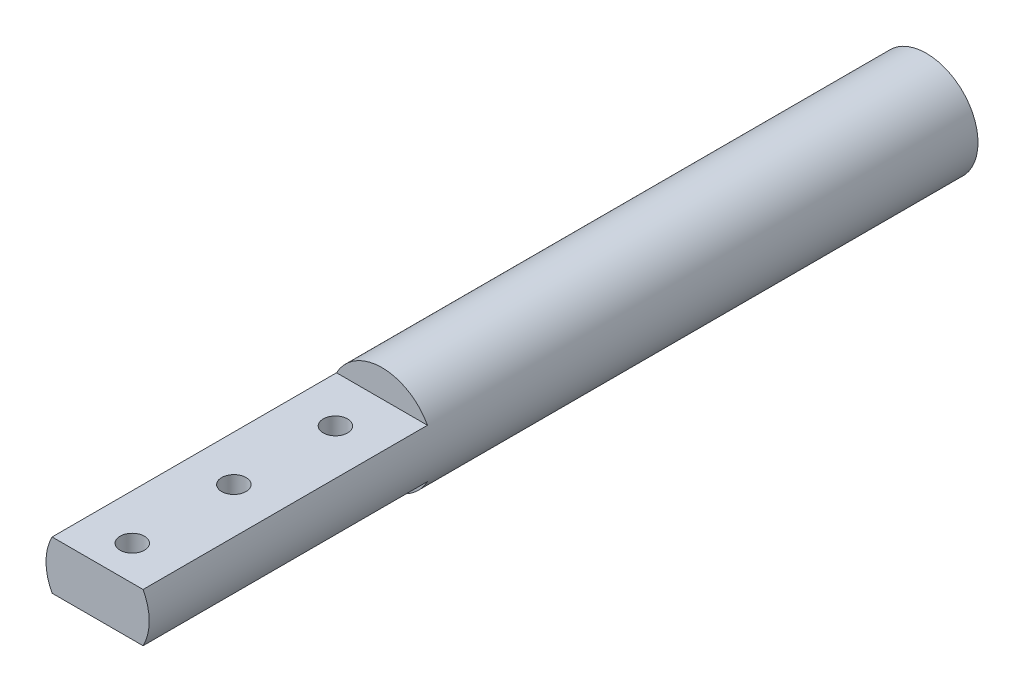
ISO-10303-21;
HEADER;
FILE_DESCRIPTION(('STEP AP214'),'2;1');
FILE_NAME('part.step','',(''),(''),'','','');
FILE_SCHEMA(('AUTOMOTIVE_DESIGN { 1 0 10303 214 1 1 1 1 }'));
ENDSEC;
DATA;
#1=APPLICATION_CONTEXT('core data for automotive mechanical design processes');
#2=APPLICATION_PROTOCOL_DEFINITION('international standard','automotive_design',2000,#1);
#3=PRODUCT_CONTEXT('',#1,'mechanical');
#4=PRODUCT('Part','Part','',(#3));
#5=PRODUCT_RELATED_PRODUCT_CATEGORY('part','',(#4));
#6=PRODUCT_DEFINITION_FORMATION('','',#4);
#7=PRODUCT_DEFINITION_CONTEXT('part definition',#1,'design');
#8=PRODUCT_DEFINITION('design','',#6,#7);
#9=PRODUCT_DEFINITION_SHAPE('','',#8);
#10=(LENGTH_UNIT() NAMED_UNIT(*) SI_UNIT(.MILLI.,.METRE.));
#11=(NAMED_UNIT(*) PLANE_ANGLE_UNIT() SI_UNIT($,.RADIAN.));
#12=(NAMED_UNIT(*) SI_UNIT($,.STERADIAN.) SOLID_ANGLE_UNIT());
#13=UNCERTAINTY_MEASURE_WITH_UNIT(LENGTH_MEASURE(1.E-05),#10,'distance_accuracy_value','');
#14=(GEOMETRIC_REPRESENTATION_CONTEXT(3) GLOBAL_UNCERTAINTY_ASSIGNED_CONTEXT((#13)) GLOBAL_UNIT_ASSIGNED_CONTEXT((#10,
#11,#12)) REPRESENTATION_CONTEXT('',''));
#15=CARTESIAN_POINT('',(0.,0.,0.));
#16=DIRECTION('',(0.,0.,1.));
#17=DIRECTION('',(1.,0.,0.));
#18=AXIS2_PLACEMENT_3D('',#15,#16,#17);
#19=CARTESIAN_POINT('',(0.,0.,51.));
#20=DIRECTION('',(0.,0.,-1.));
#21=DIRECTION('',(-1.,0.,0.));
#22=AXIS2_PLACEMENT_3D('',#19,#20,#21);
#23=CYLINDRICAL_SURFACE('',#22,6.35);
#24=CARTESIAN_POINT('',(0.,0.,51.));
#25=DIRECTION('',(0.,0.,1.));
#26=DIRECTION('',(1.,0.,0.));
#27=AXIS2_PLACEMENT_3D('',#24,#25,#26);
#28=CIRCLE('',#27,6.35);
#29=CARTESIAN_POINT('',(-5.59665078417441,3.,51.));
#30=VERTEX_POINT('',#29);
#31=CARTESIAN_POINT('',(-5.59665078417441,-3.,51.));
#32=VERTEX_POINT('',#31);
#33=EDGE_CURVE('E11',#30,#32,#28,.T.);
#34=ORIENTED_EDGE('',*,*,#33,.F.);
#35=DIRECTION('',(0.,0.,1.));
#36=VECTOR('',#35,1.);
#37=CARTESIAN_POINT('',(-5.59665078417441,3.,16.));
#38=LINE('',#37,#36);
#39=CARTESIAN_POINT('',(-5.59665078417441,3.,16.));
#40=VERTEX_POINT('',#39);
#41=EDGE_CURVE('E58',#40,#30,#38,.T.);
#42=ORIENTED_EDGE('',*,*,#41,.F.);
#43=CARTESIAN_POINT('',(0.,0.,16.));
#44=DIRECTION('',(0.,0.,1.));
#45=DIRECTION('',(1.,0.,0.));
#46=AXIS2_PLACEMENT_3D('',#43,#44,#45);
#47=CIRCLE('',#46,6.35);
#48=CARTESIAN_POINT('',(5.59665078417441,3.,16.));
#49=VERTEX_POINT('',#48);
#50=EDGE_CURVE('E77',#49,#40,#47,.T.);
#51=ORIENTED_EDGE('',*,*,#50,.F.);
#52=DIRECTION('',(0.,0.,1.));
#53=VECTOR('',#52,1.);
#54=CARTESIAN_POINT('',(5.59665078417441,3.,16.));
#55=LINE('',#54,#53);
#56=CARTESIAN_POINT('',(5.59665078417441,3.,51.));
#57=VERTEX_POINT('',#56);
#58=EDGE_CURVE('E85',#49,#57,#55,.T.);
#59=ORIENTED_EDGE('',*,*,#58,.T.);
#60=CARTESIAN_POINT('',(5.59665078417441,-3.,51.));
#61=VERTEX_POINT('',#60);
#62=EDGE_CURVE('E43',#61,#57,#28,.T.);
#63=ORIENTED_EDGE('',*,*,#62,.F.);
#64=DIRECTION('',(0.,0.,1.));
#65=VECTOR('',#64,1.);
#66=CARTESIAN_POINT('',(5.59665078417441,-3.,16.));
#67=LINE('',#66,#65);
#68=CARTESIAN_POINT('',(5.59665078417441,-3.,16.));
#69=VERTEX_POINT('',#68);
#70=EDGE_CURVE('E50',#69,#61,#67,.T.);
#71=ORIENTED_EDGE('',*,*,#70,.F.);
#72=CARTESIAN_POINT('',(0.,0.,16.));
#73=DIRECTION('',(0.,0.,1.));
#74=DIRECTION('',(1.,0.,0.));
#75=AXIS2_PLACEMENT_3D('',#72,#73,#74);
#76=CIRCLE('',#75,6.35);
#77=CARTESIAN_POINT('',(-5.59665078417441,-3.,16.));
#78=VERTEX_POINT('',#77);
#79=EDGE_CURVE('E96',#78,#69,#76,.T.);
#80=ORIENTED_EDGE('',*,*,#79,.F.);
#81=DIRECTION('',(0.,0.,1.));
#82=VECTOR('',#81,1.);
#83=CARTESIAN_POINT('',(-5.59665078417441,-3.,16.));
#84=LINE('',#83,#82);
#85=EDGE_CURVE('E100',#78,#32,#84,.T.);
#86=ORIENTED_EDGE('',*,*,#85,.T.);
#87=EDGE_LOOP('',(#34,#42,#51,#59,#63,#71,#80,#86));
#88=FACE_BOUND('',#87,.T.);
#89=CARTESIAN_POINT('',(0.,0.,-51.));
#90=DIRECTION('',(0.,0.,1.));
#91=DIRECTION('',(1.,0.,0.));
#92=AXIS2_PLACEMENT_3D('',#89,#90,#91);
#93=CIRCLE('',#92,6.35);
#94=CARTESIAN_POINT('',(6.35,0.,-51.));
#95=VERTEX_POINT('',#94);
#96=EDGE_CURVE('E38',#95,#95,#93,.T.);
#97=ORIENTED_EDGE('',*,*,#96,.T.);
#98=EDGE_LOOP('',(#97));
#99=FACE_BOUND('',#98,.T.);
#100=ADVANCED_FACE('F35',(#88,#99),#23,.T.);
#101=CARTESIAN_POINT('',(0.,0.,51.));
#102=DIRECTION('',(0.,0.,1.));
#103=DIRECTION('',(1.,0.,0.));
#104=AXIS2_PLACEMENT_3D('',#101,#102,#103);
#105=PLANE('',#104);
#106=DIRECTION('',(1.,0.,0.));
#107=VECTOR('',#106,1.);
#108=CARTESIAN_POINT('',(0.,3.,51.));
#109=LINE('',#108,#107);
#110=EDGE_CURVE('E82',#30,#57,#109,.T.);
#111=ORIENTED_EDGE('',*,*,#110,.F.);
#112=ORIENTED_EDGE('',*,*,#33,.T.);
#113=DIRECTION('',(1.,0.,0.));
#114=VECTOR('',#113,1.);
#115=CARTESIAN_POINT('',(0.,-3.,51.));
#116=LINE('',#115,#114);
#117=EDGE_CURVE('E97',#32,#61,#116,.T.);
#118=ORIENTED_EDGE('',*,*,#117,.T.);
#119=ORIENTED_EDGE('',*,*,#62,.T.);
#120=EDGE_LOOP('',(#111,#112,#118,#119));
#121=FACE_BOUND('',#120,.T.);
#122=ADVANCED_FACE('F113',(#121),#105,.T.);
#123=CARTESIAN_POINT('',(0.,0.,-51.));
#124=DIRECTION('',(0.,0.,1.));
#125=DIRECTION('',(1.,0.,0.));
#126=AXIS2_PLACEMENT_3D('',#123,#124,#125);
#127=PLANE('',#126);
#128=ORIENTED_EDGE('',*,*,#96,.F.);
#129=EDGE_LOOP('',(#128));
#130=FACE_BOUND('',#129,.T.);
#131=ADVANCED_FACE('F110',(#130),#127,.F.);
#132=CARTESIAN_POINT('',(0.,-3.,16.));
#133=DIRECTION('',(0.,-1.,0.));
#134=DIRECTION('',(0.,0.,-1.));
#135=AXIS2_PLACEMENT_3D('',#132,#133,#134);
#136=PLANE('',#135);
#137=CARTESIAN_POINT('',(0.,-3.,21.732039108368));
#138=DIRECTION('',(0.,-1.,0.));
#139=DIRECTION('',(0.,0.,-1.));
#140=AXIS2_PLACEMENT_3D('',#137,#138,#139);
#141=CIRCLE('',#140,1.5);
#142=CARTESIAN_POINT('',(0.,-3.,20.232039108368));
#143=VERTEX_POINT('',#142);
#144=EDGE_CURVE('E102',#143,#143,#141,.F.);
#145=ORIENTED_EDGE('',*,*,#144,.T.);
#146=EDGE_LOOP('',(#145));
#147=FACE_BOUND('',#146,.T.);
#148=CARTESIAN_POINT('',(1.30930550206618E-13,-3.,34.232039108368));
#149=DIRECTION('',(0.,-1.,0.));
#150=DIRECTION('',(0.,0.,-1.));
#151=AXIS2_PLACEMENT_3D('',#148,#149,#150);
#152=CIRCLE('',#151,1.5);
#153=CARTESIAN_POINT('',(1.30930550206618E-13,-3.,32.732039108368));
#154=VERTEX_POINT('',#153);
#155=EDGE_CURVE('E206',#154,#154,#152,.F.);
#156=ORIENTED_EDGE('',*,*,#155,.T.);
#157=EDGE_LOOP('',(#156));
#158=FACE_BOUND('',#157,.T.);
#159=CARTESIAN_POINT('',(2.61861100413235E-13,-3.,46.732039108368));
#160=DIRECTION('',(0.,-1.,0.));
#161=DIRECTION('',(0.,0.,-1.));
#162=AXIS2_PLACEMENT_3D('',#159,#160,#161);
#163=CIRCLE('',#162,1.5);
#164=CARTESIAN_POINT('',(2.61861100413235E-13,-3.,45.232039108368));
#165=VERTEX_POINT('',#164);
#166=EDGE_CURVE('E202',#165,#165,#163,.F.);
#167=ORIENTED_EDGE('',*,*,#166,.T.);
#168=EDGE_LOOP('',(#167));
#169=FACE_BOUND('',#168,.T.);
#170=ORIENTED_EDGE('',*,*,#117,.F.);
#171=ORIENTED_EDGE('',*,*,#85,.F.);
#172=DIRECTION('',(1.,0.,0.));
#173=VECTOR('',#172,1.);
#174=CARTESIAN_POINT('',(0.,-3.,16.));
#175=LINE('',#174,#173);
#176=EDGE_CURVE('E94',#78,#69,#175,.T.);
#177=ORIENTED_EDGE('',*,*,#176,.T.);
#178=ORIENTED_EDGE('',*,*,#70,.T.);
#179=EDGE_LOOP('',(#170,#171,#177,#178));
#180=FACE_BOUND('',#179,.T.);
#181=ADVANCED_FACE('F112',(#147,#158,#169,#180),#136,.T.);
#182=CARTESIAN_POINT('',(0.,0.,16.));
#183=DIRECTION('',(0.,0.,1.));
#184=DIRECTION('',(1.,0.,0.));
#185=AXIS2_PLACEMENT_3D('',#182,#183,#184);
#186=PLANE('',#185);
#187=ORIENTED_EDGE('',*,*,#176,.F.);
#188=ORIENTED_EDGE('',*,*,#79,.T.);
#189=EDGE_LOOP('',(#187,#188));
#190=FACE_BOUND('',#189,.T.);
#191=ADVANCED_FACE('F118',(#190),#186,.T.);
#192=CARTESIAN_POINT('',(0.,3.,16.));
#193=DIRECTION('',(0.,-1.,0.));
#194=DIRECTION('',(0.,0.,-1.));
#195=AXIS2_PLACEMENT_3D('',#192,#193,#194);
#196=PLANE('',#195);
#197=CARTESIAN_POINT('',(0.,3.,21.732039108368));
#198=DIRECTION('',(0.,-1.,0.));
#199=DIRECTION('',(0.,0.,-1.));
#200=AXIS2_PLACEMENT_3D('',#197,#198,#199);
#201=CIRCLE('',#200,1.5);
#202=CARTESIAN_POINT('',(0.,3.,20.232039108368));
#203=VERTEX_POINT('',#202);
#204=EDGE_CURVE('E201',#203,#203,#201,.T.);
#205=ORIENTED_EDGE('',*,*,#204,.T.);
#206=EDGE_LOOP('',(#205));
#207=FACE_BOUND('',#206,.T.);
#208=CARTESIAN_POINT('',(1.30930550206618E-13,3.,34.232039108368));
#209=DIRECTION('',(0.,-1.,0.));
#210=DIRECTION('',(0.,0.,-1.));
#211=AXIS2_PLACEMENT_3D('',#208,#209,#210);
#212=CIRCLE('',#211,1.5);
#213=CARTESIAN_POINT('',(1.30930550206618E-13,3.,32.732039108368));
#214=VERTEX_POINT('',#213);
#215=EDGE_CURVE('E203',#214,#214,#212,.T.);
#216=ORIENTED_EDGE('',*,*,#215,.T.);
#217=EDGE_LOOP('',(#216));
#218=FACE_BOUND('',#217,.T.);
#219=CARTESIAN_POINT('',(2.61861100413235E-13,3.,46.732039108368));
#220=DIRECTION('',(0.,-1.,0.));
#221=DIRECTION('',(0.,0.,-1.));
#222=AXIS2_PLACEMENT_3D('',#219,#220,#221);
#223=CIRCLE('',#222,1.5);
#224=CARTESIAN_POINT('',(2.61861100413235E-13,3.,45.232039108368));
#225=VERTEX_POINT('',#224);
#226=EDGE_CURVE('E209',#225,#225,#223,.T.);
#227=ORIENTED_EDGE('',*,*,#226,.T.);
#228=EDGE_LOOP('',(#227));
#229=FACE_BOUND('',#228,.T.);
#230=ORIENTED_EDGE('',*,*,#110,.T.);
#231=ORIENTED_EDGE('',*,*,#58,.F.);
#232=DIRECTION('',(1.,0.,0.));
#233=VECTOR('',#232,1.);
#234=CARTESIAN_POINT('',(0.,3.,16.));
#235=LINE('',#234,#233);
#236=EDGE_CURVE('E79',#40,#49,#235,.T.);
#237=ORIENTED_EDGE('',*,*,#236,.F.);
#238=ORIENTED_EDGE('',*,*,#41,.T.);
#239=EDGE_LOOP('',(#230,#231,#237,#238));
#240=FACE_BOUND('',#239,.T.);
#241=ADVANCED_FACE('F84',(#207,#218,#229,#240),#196,.F.);
#242=CARTESIAN_POINT('',(0.,0.,16.));
#243=DIRECTION('',(0.,0.,1.));
#244=DIRECTION('',(1.,0.,0.));
#245=AXIS2_PLACEMENT_3D('',#242,#243,#244);
#246=PLANE('',#245);
#247=ORIENTED_EDGE('',*,*,#50,.T.);
#248=ORIENTED_EDGE('',*,*,#236,.T.);
#249=EDGE_LOOP('',(#247,#248));
#250=FACE_BOUND('',#249,.T.);
#251=ADVANCED_FACE('F78',(#250),#246,.T.);
#252=CARTESIAN_POINT('',(2.61861100413235E-13,-12.,46.732039108368));
#253=DIRECTION('',(0.,1.,0.));
#254=DIRECTION('',(0.,0.,1.));
#255=AXIS2_PLACEMENT_3D('',#252,#253,#254);
#256=CYLINDRICAL_SURFACE('',#255,1.5);
#257=ORIENTED_EDGE('',*,*,#166,.F.);
#258=EDGE_LOOP('',(#257));
#259=FACE_BOUND('',#258,.T.);
#260=ORIENTED_EDGE('',*,*,#226,.F.);
#261=EDGE_LOOP('',(#260));
#262=FACE_BOUND('',#261,.T.);
#263=ADVANCED_FACE('F151',(#259,#262),#256,.F.);
#264=CARTESIAN_POINT('',(1.30930550206618E-13,-12.,34.232039108368));
#265=DIRECTION('',(0.,1.,0.));
#266=DIRECTION('',(0.,0.,1.));
#267=AXIS2_PLACEMENT_3D('',#264,#265,#266);
#268=CYLINDRICAL_SURFACE('',#267,1.5);
#269=ORIENTED_EDGE('',*,*,#155,.F.);
#270=EDGE_LOOP('',(#269));
#271=FACE_BOUND('',#270,.T.);
#272=ORIENTED_EDGE('',*,*,#215,.F.);
#273=EDGE_LOOP('',(#272));
#274=FACE_BOUND('',#273,.T.);
#275=ADVANCED_FACE('F172',(#271,#274),#268,.F.);
#276=CARTESIAN_POINT('',(0.,-12.,21.732039108368));
#277=DIRECTION('',(0.,1.,0.));
#278=DIRECTION('',(0.,0.,1.));
#279=AXIS2_PLACEMENT_3D('',#276,#277,#278);
#280=CYLINDRICAL_SURFACE('',#279,1.5);
#281=ORIENTED_EDGE('',*,*,#144,.F.);
#282=EDGE_LOOP('',(#281));
#283=FACE_BOUND('',#282,.T.);
#284=ORIENTED_EDGE('',*,*,#204,.F.);
#285=EDGE_LOOP('',(#284));
#286=FACE_BOUND('',#285,.T.);
#287=ADVANCED_FACE('F182',(#283,#286),#280,.F.);
#288=CLOSED_SHELL('',(#100,#122,#131,#181,#191,#241,#251,#263,#275,#287));
#289=MANIFOLD_SOLID_BREP('B2',#288);
#290=ADVANCED_BREP_SHAPE_REPRESENTATION('',(#18,#289),#14);
#291=SHAPE_DEFINITION_REPRESENTATION(#9,#290);
ENDSEC;
END-ISO-10303-21;
